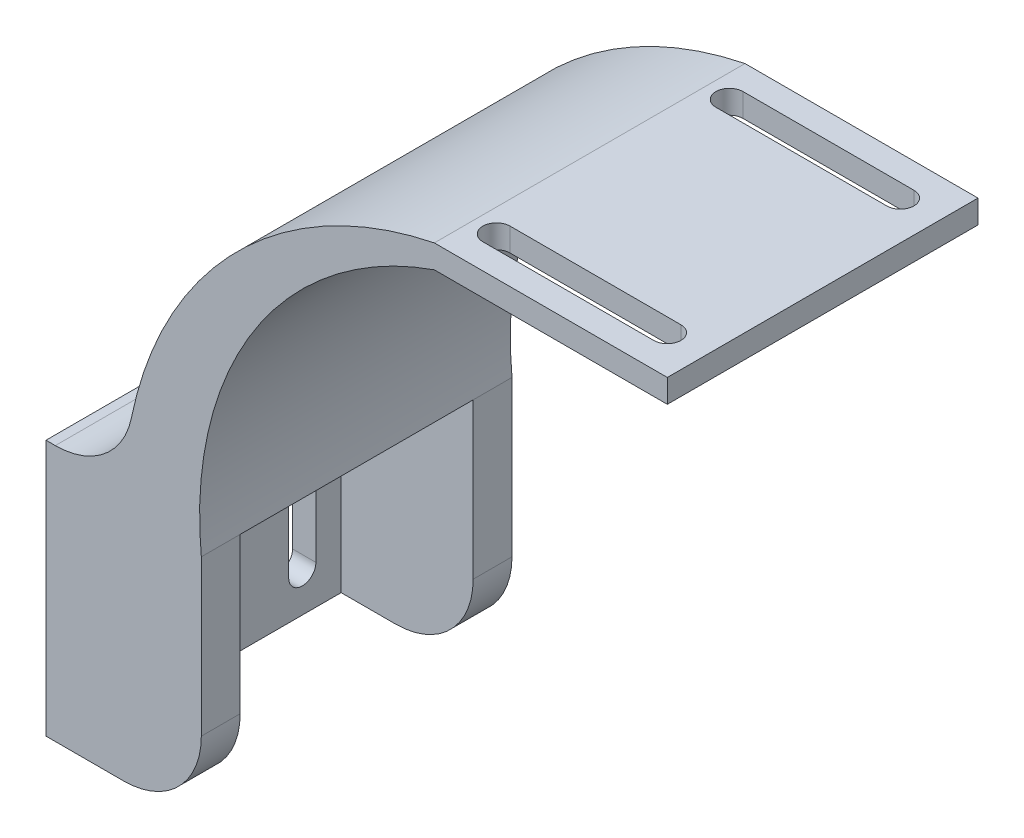
ISO-10303-21;
HEADER;
FILE_DESCRIPTION(('STEP AP214'),'2;1');
FILE_NAME('part.step','',(''),(''),'','','');
FILE_SCHEMA(('AUTOMOTIVE_DESIGN { 1 0 10303 214 1 1 1 1 }'));
ENDSEC;
DATA;
#1=APPLICATION_CONTEXT('core data for automotive mechanical design processes');
#2=APPLICATION_PROTOCOL_DEFINITION('international standard','automotive_design',2000,#1);
#3=PRODUCT_CONTEXT('',#1,'mechanical');
#4=PRODUCT('Part','Part','',(#3));
#5=PRODUCT_RELATED_PRODUCT_CATEGORY('part','',(#4));
#6=PRODUCT_DEFINITION_FORMATION('','',#4);
#7=PRODUCT_DEFINITION_CONTEXT('part definition',#1,'design');
#8=PRODUCT_DEFINITION('design','',#6,#7);
#9=PRODUCT_DEFINITION_SHAPE('','',#8);
#10=(LENGTH_UNIT() NAMED_UNIT(*) SI_UNIT(.MILLI.,.METRE.));
#11=(NAMED_UNIT(*) PLANE_ANGLE_UNIT() SI_UNIT($,.RADIAN.));
#12=(NAMED_UNIT(*) SI_UNIT($,.STERADIAN.) SOLID_ANGLE_UNIT());
#13=UNCERTAINTY_MEASURE_WITH_UNIT(LENGTH_MEASURE(1.E-05),#10,'distance_accuracy_value','');
#14=(GEOMETRIC_REPRESENTATION_CONTEXT(3) GLOBAL_UNCERTAINTY_ASSIGNED_CONTEXT((#13)) GLOBAL_UNIT_ASSIGNED_CONTEXT((#10,
#11,#12)) REPRESENTATION_CONTEXT('',''));
#15=CARTESIAN_POINT('',(0.,0.,0.));
#16=DIRECTION('',(0.,0.,1.));
#17=DIRECTION('',(1.,0.,0.));
#18=AXIS2_PLACEMENT_3D('',#15,#16,#17);
#19=CARTESIAN_POINT('',(3.,10.,-10.));
#20=DIRECTION('',(-1.,0.,0.));
#21=DIRECTION('',(0.,0.,1.));
#22=AXIS2_PLACEMENT_3D('',#19,#20,#21);
#23=CYLINDRICAL_SURFACE('',#22,1.75);
#24=CARTESIAN_POINT('',(0.,10.,-10.));
#25=DIRECTION('',(1.,0.,0.));
#26=DIRECTION('',(0.,0.,-1.));
#27=AXIS2_PLACEMENT_3D('',#24,#25,#26);
#28=CIRCLE('',#27,1.75);
#29=CARTESIAN_POINT('',(0.,10.,-11.75));
#30=VERTEX_POINT('',#29);
#31=CARTESIAN_POINT('',(0.,10.,-8.24999999999999));
#32=VERTEX_POINT('',#31);
#33=EDGE_CURVE('E462',#30,#32,#28,.T.);
#34=ORIENTED_EDGE('',*,*,#33,.F.);
#35=DIRECTION('',(-1.,0.,0.));
#36=VECTOR('',#35,1.);
#37=CARTESIAN_POINT('',(3.,10.,-11.75));
#38=LINE('',#37,#36);
#39=CARTESIAN_POINT('',(3.,10.,-11.75));
#40=VERTEX_POINT('',#39);
#41=EDGE_CURVE('E482',#40,#30,#38,.T.);
#42=ORIENTED_EDGE('',*,*,#41,.F.);
#43=CARTESIAN_POINT('',(3.,10.,-10.));
#44=DIRECTION('',(1.,0.,0.));
#45=DIRECTION('',(0.,0.,-1.));
#46=AXIS2_PLACEMENT_3D('',#43,#44,#45);
#47=CIRCLE('',#46,1.75);
#48=CARTESIAN_POINT('',(3.,10.,-8.24999999999999));
#49=VERTEX_POINT('',#48);
#50=EDGE_CURVE('E428',#40,#49,#47,.T.);
#51=ORIENTED_EDGE('',*,*,#50,.T.);
#52=DIRECTION('',(-1.,0.,0.));
#53=VECTOR('',#52,1.);
#54=CARTESIAN_POINT('',(3.,10.,-8.24999999999999));
#55=LINE('',#54,#53);
#56=EDGE_CURVE('E475',#49,#32,#55,.T.);
#57=ORIENTED_EDGE('',*,*,#56,.T.);
#58=EDGE_LOOP('',(#34,#42,#51,#57));
#59=FACE_BOUND('',#58,.T.);
#60=ADVANCED_FACE('F71',(#59),#23,.F.);
#61=CARTESIAN_POINT('',(3.,0.,-11.75));
#62=DIRECTION('',(0.,0.,-1.));
#63=DIRECTION('',(0.,1.,0.));
#64=AXIS2_PLACEMENT_3D('',#61,#62,#63);
#65=PLANE('',#64);
#66=DIRECTION('',(0.,-1.,0.));
#67=VECTOR('',#66,1.);
#68=CARTESIAN_POINT('',(0.,0.,-11.75));
#69=LINE('',#68,#67);
#70=CARTESIAN_POINT('',(0.,-10.,-11.75));
#71=VERTEX_POINT('',#70);
#72=EDGE_CURVE('E465',#30,#71,#69,.T.);
#73=ORIENTED_EDGE('',*,*,#72,.T.);
#74=DIRECTION('',(-1.,0.,0.));
#75=VECTOR('',#74,1.);
#76=CARTESIAN_POINT('',(3.,-10.,-11.75));
#77=LINE('',#76,#75);
#78=CARTESIAN_POINT('',(3.,-10.,-11.75));
#79=VERTEX_POINT('',#78);
#80=EDGE_CURVE('E480',#79,#71,#77,.T.);
#81=ORIENTED_EDGE('',*,*,#80,.F.);
#82=DIRECTION('',(0.,-1.,0.));
#83=VECTOR('',#82,1.);
#84=CARTESIAN_POINT('',(3.,0.,-11.75));
#85=LINE('',#84,#83);
#86=EDGE_CURVE('E431',#40,#79,#85,.T.);
#87=ORIENTED_EDGE('',*,*,#86,.F.);
#88=ORIENTED_EDGE('',*,*,#41,.T.);
#89=EDGE_LOOP('',(#73,#81,#87,#88));
#90=FACE_BOUND('',#89,.T.);
#91=ADVANCED_FACE('F551',(#90),#65,.F.);
#92=CARTESIAN_POINT('',(3.,-10.,-10.));
#93=DIRECTION('',(-1.,0.,0.));
#94=DIRECTION('',(0.,0.,1.));
#95=AXIS2_PLACEMENT_3D('',#92,#93,#94);
#96=CYLINDRICAL_SURFACE('',#95,1.75);
#97=CARTESIAN_POINT('',(0.,-10.,-10.));
#98=DIRECTION('',(1.,0.,0.));
#99=DIRECTION('',(0.,0.,-1.));
#100=AXIS2_PLACEMENT_3D('',#97,#98,#99);
#101=CIRCLE('',#100,1.75);
#102=CARTESIAN_POINT('',(0.,-10.,-8.25));
#103=VERTEX_POINT('',#102);
#104=EDGE_CURVE('E468',#103,#71,#101,.T.);
#105=ORIENTED_EDGE('',*,*,#104,.F.);
#106=DIRECTION('',(-1.,0.,0.));
#107=VECTOR('',#106,1.);
#108=CARTESIAN_POINT('',(3.,-10.,-8.25));
#109=LINE('',#108,#107);
#110=CARTESIAN_POINT('',(3.,-10.,-8.25));
#111=VERTEX_POINT('',#110);
#112=EDGE_CURVE('E477',#111,#103,#109,.T.);
#113=ORIENTED_EDGE('',*,*,#112,.F.);
#114=CARTESIAN_POINT('',(3.,-10.,-10.));
#115=DIRECTION('',(1.,0.,0.));
#116=DIRECTION('',(0.,0.,-1.));
#117=AXIS2_PLACEMENT_3D('',#114,#115,#116);
#118=CIRCLE('',#117,1.75);
#119=EDGE_CURVE('E433',#111,#79,#118,.T.);
#120=ORIENTED_EDGE('',*,*,#119,.T.);
#121=ORIENTED_EDGE('',*,*,#80,.T.);
#122=EDGE_LOOP('',(#105,#113,#120,#121));
#123=FACE_BOUND('',#122,.T.);
#124=ADVANCED_FACE('F557',(#123),#96,.F.);
#125=CARTESIAN_POINT('',(3.,10.,10.));
#126=DIRECTION('',(-1.,0.,0.));
#127=DIRECTION('',(0.,0.,1.));
#128=AXIS2_PLACEMENT_3D('',#125,#126,#127);
#129=CYLINDRICAL_SURFACE('',#128,1.75);
#130=CARTESIAN_POINT('',(0.,10.,10.));
#131=DIRECTION('',(1.,0.,0.));
#132=DIRECTION('',(0.,0.,-1.));
#133=AXIS2_PLACEMENT_3D('',#130,#131,#132);
#134=CIRCLE('',#133,1.75);
#135=CARTESIAN_POINT('',(0.,10.,8.25));
#136=VERTEX_POINT('',#135);
#137=CARTESIAN_POINT('',(0.,10.,11.75));
#138=VERTEX_POINT('',#137);
#139=EDGE_CURVE('E410',#136,#138,#134,.T.);
#140=ORIENTED_EDGE('',*,*,#139,.F.);
#141=DIRECTION('',(-1.,0.,0.));
#142=VECTOR('',#141,1.);
#143=CARTESIAN_POINT('',(3.,10.,8.25));
#144=LINE('',#143,#142);
#145=CARTESIAN_POINT('',(3.,10.,8.25));
#146=VERTEX_POINT('',#145);
#147=EDGE_CURVE('E478',#146,#136,#144,.T.);
#148=ORIENTED_EDGE('',*,*,#147,.F.);
#149=CARTESIAN_POINT('',(3.,10.,10.));
#150=DIRECTION('',(1.,0.,0.));
#151=DIRECTION('',(0.,0.,-1.));
#152=AXIS2_PLACEMENT_3D('',#149,#150,#151);
#153=CIRCLE('',#152,1.75);
#154=CARTESIAN_POINT('',(3.,10.,11.75));
#155=VERTEX_POINT('',#154);
#156=EDGE_CURVE('E416',#146,#155,#153,.T.);
#157=ORIENTED_EDGE('',*,*,#156,.T.);
#158=DIRECTION('',(-1.,0.,0.));
#159=VECTOR('',#158,1.);
#160=CARTESIAN_POINT('',(3.,10.,11.75));
#161=LINE('',#160,#159);
#162=EDGE_CURVE('E450',#155,#138,#161,.T.);
#163=ORIENTED_EDGE('',*,*,#162,.T.);
#164=EDGE_LOOP('',(#140,#148,#157,#163));
#165=FACE_BOUND('',#164,.T.);
#166=ADVANCED_FACE('F576',(#165),#129,.F.);
#167=CARTESIAN_POINT('',(3.,0.,8.25));
#168=DIRECTION('',(0.,0.,-1.));
#169=DIRECTION('',(0.,1.,0.));
#170=AXIS2_PLACEMENT_3D('',#167,#168,#169);
#171=PLANE('',#170);
#172=DIRECTION('',(0.,-1.,0.));
#173=VECTOR('',#172,1.);
#174=CARTESIAN_POINT('',(0.,0.,8.25));
#175=LINE('',#174,#173);
#176=CARTESIAN_POINT('',(0.,-10.,8.25));
#177=VERTEX_POINT('',#176);
#178=EDGE_CURVE('E453',#136,#177,#175,.T.);
#179=ORIENTED_EDGE('',*,*,#178,.T.);
#180=DIRECTION('',(-1.,0.,0.));
#181=VECTOR('',#180,1.);
#182=CARTESIAN_POINT('',(3.,-10.,8.25));
#183=LINE('',#182,#181);
#184=CARTESIAN_POINT('',(3.,-10.,8.25));
#185=VERTEX_POINT('',#184);
#186=EDGE_CURVE('E488',#185,#177,#183,.T.);
#187=ORIENTED_EDGE('',*,*,#186,.F.);
#188=DIRECTION('',(0.,-1.,0.));
#189=VECTOR('',#188,1.);
#190=CARTESIAN_POINT('',(3.,0.,8.25));
#191=LINE('',#190,#189);
#192=EDGE_CURVE('E419',#146,#185,#191,.T.);
#193=ORIENTED_EDGE('',*,*,#192,.F.);
#194=ORIENTED_EDGE('',*,*,#147,.T.);
#195=EDGE_LOOP('',(#179,#187,#193,#194));
#196=FACE_BOUND('',#195,.T.);
#197=ADVANCED_FACE('F572',(#196),#171,.F.);
#198=CARTESIAN_POINT('',(3.,-10.,10.));
#199=DIRECTION('',(-1.,0.,0.));
#200=DIRECTION('',(0.,0.,1.));
#201=AXIS2_PLACEMENT_3D('',#198,#199,#200);
#202=CYLINDRICAL_SURFACE('',#201,1.75);
#203=CARTESIAN_POINT('',(0.,-10.,10.));
#204=DIRECTION('',(1.,0.,0.));
#205=DIRECTION('',(0.,0.,-1.));
#206=AXIS2_PLACEMENT_3D('',#203,#204,#205);
#207=CIRCLE('',#206,1.75);
#208=CARTESIAN_POINT('',(0.,-10.,11.75));
#209=VERTEX_POINT('',#208);
#210=EDGE_CURVE('E456',#209,#177,#207,.T.);
#211=ORIENTED_EDGE('',*,*,#210,.F.);
#212=DIRECTION('',(-1.,0.,0.));
#213=VECTOR('',#212,1.);
#214=CARTESIAN_POINT('',(3.,-10.,11.75));
#215=LINE('',#214,#213);
#216=CARTESIAN_POINT('',(3.,-10.,11.75));
#217=VERTEX_POINT('',#216);
#218=EDGE_CURVE('E486',#217,#209,#215,.T.);
#219=ORIENTED_EDGE('',*,*,#218,.F.);
#220=CARTESIAN_POINT('',(3.,-10.,10.));
#221=DIRECTION('',(1.,0.,0.));
#222=DIRECTION('',(0.,0.,-1.));
#223=AXIS2_PLACEMENT_3D('',#220,#221,#222);
#224=CIRCLE('',#223,1.75);
#225=EDGE_CURVE('E422',#217,#185,#224,.T.);
#226=ORIENTED_EDGE('',*,*,#225,.T.);
#227=ORIENTED_EDGE('',*,*,#186,.T.);
#228=EDGE_LOOP('',(#211,#219,#226,#227));
#229=FACE_BOUND('',#228,.T.);
#230=ADVANCED_FACE('F569',(#229),#202,.F.);
#231=CARTESIAN_POINT('',(3.,0.,-8.25));
#232=DIRECTION('',(0.,0.,-1.));
#233=DIRECTION('',(0.,1.,0.));
#234=AXIS2_PLACEMENT_3D('',#231,#232,#233);
#235=PLANE('',#234);
#236=DIRECTION('',(0.,-1.,0.));
#237=VECTOR('',#236,1.);
#238=CARTESIAN_POINT('',(0.,0.,-8.25));
#239=LINE('',#238,#237);
#240=EDGE_CURVE('E471',#32,#103,#239,.T.);
#241=ORIENTED_EDGE('',*,*,#240,.F.);
#242=ORIENTED_EDGE('',*,*,#56,.F.);
#243=DIRECTION('',(0.,-1.,0.));
#244=VECTOR('',#243,1.);
#245=CARTESIAN_POINT('',(3.,0.,-8.25));
#246=LINE('',#245,#244);
#247=EDGE_CURVE('E436',#49,#111,#246,.T.);
#248=ORIENTED_EDGE('',*,*,#247,.T.);
#249=ORIENTED_EDGE('',*,*,#112,.T.);
#250=EDGE_LOOP('',(#241,#242,#248,#249));
#251=FACE_BOUND('',#250,.T.);
#252=ADVANCED_FACE('F567',(#251),#235,.T.);
#253=CARTESIAN_POINT('',(3.,0.,11.75));
#254=DIRECTION('',(0.,0.,-1.));
#255=DIRECTION('',(0.,1.,0.));
#256=AXIS2_PLACEMENT_3D('',#253,#254,#255);
#257=PLANE('',#256);
#258=DIRECTION('',(0.,-1.,0.));
#259=VECTOR('',#258,1.);
#260=CARTESIAN_POINT('',(0.,0.,11.75));
#261=LINE('',#260,#259);
#262=EDGE_CURVE('E459',#138,#209,#261,.T.);
#263=ORIENTED_EDGE('',*,*,#262,.F.);
#264=ORIENTED_EDGE('',*,*,#162,.F.);
#265=DIRECTION('',(0.,-1.,0.));
#266=VECTOR('',#265,1.);
#267=CARTESIAN_POINT('',(3.,0.,11.75));
#268=LINE('',#267,#266);
#269=EDGE_CURVE('E425',#155,#217,#268,.T.);
#270=ORIENTED_EDGE('',*,*,#269,.T.);
#271=ORIENTED_EDGE('',*,*,#218,.T.);
#272=EDGE_LOOP('',(#263,#264,#270,#271));
#273=FACE_BOUND('',#272,.T.);
#274=ADVANCED_FACE('F563',(#273),#257,.T.);
#275=CARTESIAN_POINT('',(3.,-15.,0.));
#276=DIRECTION('',(0.,1.,0.));
#277=DIRECTION('',(0.,0.,1.));
#278=AXIS2_PLACEMENT_3D('',#275,#276,#277);
#279=PLANE('',#278);
#280=DIRECTION('',(1.,0.,0.));
#281=VECTOR('',#280,1.);
#282=CARTESIAN_POINT('',(0.,-15.,-20.));
#283=LINE('',#282,#281);
#284=CARTESIAN_POINT('',(0.,-15.,-20.));
#285=VERTEX_POINT('',#284);
#286=CARTESIAN_POINT('',(10.,-15.,-20.));
#287=VERTEX_POINT('',#286);
#288=EDGE_CURVE('E400',#285,#287,#283,.T.);
#289=ORIENTED_EDGE('',*,*,#288,.T.);
#290=DIRECTION('',(0.,0.,1.));
#291=VECTOR('',#290,1.);
#292=CARTESIAN_POINT('',(10.,-15.,-15.));
#293=LINE('',#292,#291);
#294=CARTESIAN_POINT('',(10.,-15.,-15.));
#295=VERTEX_POINT('',#294);
#296=EDGE_CURVE('E502',#287,#295,#293,.T.);
#297=ORIENTED_EDGE('',*,*,#296,.T.);
#298=DIRECTION('',(-1.,0.,0.));
#299=VECTOR('',#298,1.);
#300=CARTESIAN_POINT('',(0.,-15.,-15.));
#301=LINE('',#300,#299);
#302=CARTESIAN_POINT('',(3.,-15.,-15.));
#303=VERTEX_POINT('',#302);
#304=EDGE_CURVE('E390',#295,#303,#301,.T.);
#305=ORIENTED_EDGE('',*,*,#304,.T.);
#306=DIRECTION('',(0.,0.,-1.));
#307=VECTOR('',#306,1.);
#308=CARTESIAN_POINT('',(3.,-15.,0.));
#309=LINE('',#308,#307);
#310=CARTESIAN_POINT('',(3.,-15.,15.));
#311=VERTEX_POINT('',#310);
#312=EDGE_CURVE('E447',#311,#303,#309,.T.);
#313=ORIENTED_EDGE('',*,*,#312,.F.);
#314=DIRECTION('',(-1.,0.,0.));
#315=VECTOR('',#314,1.);
#316=CARTESIAN_POINT('',(0.,-15.,15.));
#317=LINE('',#316,#315);
#318=CARTESIAN_POINT('',(10.,-15.,15.));
#319=VERTEX_POINT('',#318);
#320=EDGE_CURVE('E381',#319,#311,#317,.T.);
#321=ORIENTED_EDGE('',*,*,#320,.F.);
#322=DIRECTION('',(0.,0.,1.));
#323=VECTOR('',#322,1.);
#324=CARTESIAN_POINT('',(10.,-15.,20.));
#325=LINE('',#324,#323);
#326=CARTESIAN_POINT('',(10.,-15.,20.));
#327=VERTEX_POINT('',#326);
#328=EDGE_CURVE('E499',#319,#327,#325,.T.);
#329=ORIENTED_EDGE('',*,*,#328,.T.);
#330=DIRECTION('',(-1.,0.,0.));
#331=VECTOR('',#330,1.);
#332=CARTESIAN_POINT('',(0.,-15.,20.));
#333=LINE('',#332,#331);
#334=CARTESIAN_POINT('',(0.,-15.,20.));
#335=VERTEX_POINT('',#334);
#336=EDGE_CURVE('E352',#327,#335,#333,.T.);
#337=ORIENTED_EDGE('',*,*,#336,.T.);
#338=DIRECTION('',(0.,0.,-1.));
#339=VECTOR('',#338,1.);
#340=CARTESIAN_POINT('',(0.,-15.,0.));
#341=LINE('',#340,#339);
#342=EDGE_CURVE('E420',#335,#285,#341,.T.);
#343=ORIENTED_EDGE('',*,*,#342,.T.);
#344=EDGE_LOOP('',(#289,#297,#305,#313,#321,#329,#337,#343));
#345=FACE_BOUND('',#344,.T.);
#346=ADVANCED_FACE('F566',(#345),#279,.F.);
#347=CARTESIAN_POINT('',(3.,0.,0.));
#348=DIRECTION('',(1.,0.,0.));
#349=DIRECTION('',(0.,0.,-1.));
#350=AXIS2_PLACEMENT_3D('',#347,#348,#349);
#351=PLANE('',#350);
#352=ORIENTED_EDGE('',*,*,#156,.F.);
#353=ORIENTED_EDGE('',*,*,#192,.T.);
#354=ORIENTED_EDGE('',*,*,#225,.F.);
#355=ORIENTED_EDGE('',*,*,#269,.F.);
#356=EDGE_LOOP('',(#352,#353,#354,#355));
#357=FACE_BOUND('',#356,.T.);
#358=ORIENTED_EDGE('',*,*,#50,.F.);
#359=ORIENTED_EDGE('',*,*,#86,.T.);
#360=ORIENTED_EDGE('',*,*,#119,.F.);
#361=ORIENTED_EDGE('',*,*,#247,.F.);
#362=EDGE_LOOP('',(#358,#359,#360,#361));
#363=FACE_BOUND('',#362,.T.);
#364=DIRECTION('',(0.,-1.,0.));
#365=VECTOR('',#364,1.);
#366=CARTESIAN_POINT('',(3.,0.,-15.));
#367=LINE('',#366,#365);
#368=CARTESIAN_POINT('',(3.,15.,-15.));
#369=VERTEX_POINT('',#368);
#370=EDGE_CURVE('E439',#369,#303,#367,.T.);
#371=ORIENTED_EDGE('',*,*,#370,.F.);
#372=DIRECTION('',(0.,0.,-1.));
#373=VECTOR('',#372,1.);
#374=CARTESIAN_POINT('',(3.,15.,0.));
#375=LINE('',#374,#373);
#376=CARTESIAN_POINT('',(3.,15.,15.));
#377=VERTEX_POINT('',#376);
#378=EDGE_CURVE('E442',#377,#369,#375,.T.);
#379=ORIENTED_EDGE('',*,*,#378,.F.);
#380=DIRECTION('',(0.,-1.,0.));
#381=VECTOR('',#380,1.);
#382=CARTESIAN_POINT('',(3.,0.,15.));
#383=LINE('',#382,#381);
#384=EDGE_CURVE('E444',#377,#311,#383,.T.);
#385=ORIENTED_EDGE('',*,*,#384,.T.);
#386=ORIENTED_EDGE('',*,*,#312,.T.);
#387=EDGE_LOOP('',(#371,#379,#385,#386));
#388=FACE_BOUND('',#387,.T.);
#389=ADVANCED_FACE('F644',(#357,#363,#388),#351,.T.);
#390=CARTESIAN_POINT('',(0.,0.,0.));
#391=DIRECTION('',(1.,0.,0.));
#392=DIRECTION('',(0.,0.,-1.));
#393=AXIS2_PLACEMENT_3D('',#390,#391,#392);
#394=PLANE('',#393);
#395=ORIENTED_EDGE('',*,*,#139,.T.);
#396=ORIENTED_EDGE('',*,*,#262,.T.);
#397=ORIENTED_EDGE('',*,*,#210,.T.);
#398=ORIENTED_EDGE('',*,*,#178,.F.);
#399=EDGE_LOOP('',(#395,#396,#397,#398));
#400=FACE_BOUND('',#399,.T.);
#401=ORIENTED_EDGE('',*,*,#33,.T.);
#402=ORIENTED_EDGE('',*,*,#240,.T.);
#403=ORIENTED_EDGE('',*,*,#104,.T.);
#404=ORIENTED_EDGE('',*,*,#72,.F.);
#405=EDGE_LOOP('',(#401,#402,#403,#404));
#406=FACE_BOUND('',#405,.T.);
#407=DIRECTION('',(0.,-1.,0.));
#408=VECTOR('',#407,1.);
#409=CARTESIAN_POINT('',(0.,15.,20.));
#410=LINE('',#409,#408);
#411=CARTESIAN_POINT('',(0.,18.,20.));
#412=VERTEX_POINT('',#411);
#413=EDGE_CURVE('E384',#412,#335,#410,.T.);
#414=ORIENTED_EDGE('',*,*,#413,.F.);
#415=DIRECTION('',(0.,0.,1.));
#416=VECTOR('',#415,1.);
#417=CARTESIAN_POINT('',(0.,18.,-20.));
#418=LINE('',#417,#416);
#419=CARTESIAN_POINT('',(0.,18.,-20.));
#420=VERTEX_POINT('',#419);
#421=EDGE_CURVE('E356',#420,#412,#418,.T.);
#422=ORIENTED_EDGE('',*,*,#421,.F.);
#423=DIRECTION('',(0.,-1.,0.));
#424=VECTOR('',#423,1.);
#425=CARTESIAN_POINT('',(0.,15.,-20.));
#426=LINE('',#425,#424);
#427=EDGE_CURVE('E411',#420,#285,#426,.T.);
#428=ORIENTED_EDGE('',*,*,#427,.T.);
#429=ORIENTED_EDGE('',*,*,#342,.F.);
#430=EDGE_LOOP('',(#414,#422,#428,#429));
#431=FACE_BOUND('',#430,.T.);
#432=ADVANCED_FACE('F605',(#400,#406,#431),#394,.F.);
#433=CARTESIAN_POINT('',(20.,15.,0.));
#434=DIRECTION('',(1.,0.,0.));
#435=DIRECTION('',(0.,0.,-1.));
#436=AXIS2_PLACEMENT_3D('',#433,#434,#435);
#437=PLANE('',#436);
#438=DIRECTION('',(0.,-1.,0.));
#439=VECTOR('',#438,1.);
#440=CARTESIAN_POINT('',(20.,15.,-15.));
#441=LINE('',#440,#439);
#442=CARTESIAN_POINT('',(20.,15.,-15.));
#443=VERTEX_POINT('',#442);
#444=CARTESIAN_POINT('',(20.,-5.,-15.));
#445=VERTEX_POINT('',#444);
#446=EDGE_CURVE('E403',#443,#445,#441,.T.);
#447=ORIENTED_EDGE('',*,*,#446,.T.);
#448=DIRECTION('',(0.,0.,1.));
#449=VECTOR('',#448,1.);
#450=CARTESIAN_POINT('',(20.,-5.,-20.));
#451=LINE('',#450,#449);
#452=CARTESIAN_POINT('',(20.,-5.,-20.));
#453=VERTEX_POINT('',#452);
#454=EDGE_CURVE('E507',#445,#453,#451,.F.);
#455=ORIENTED_EDGE('',*,*,#454,.T.);
#456=DIRECTION('',(0.,-1.,0.));
#457=VECTOR('',#456,1.);
#458=CARTESIAN_POINT('',(20.,15.,-20.));
#459=LINE('',#458,#457);
#460=CARTESIAN_POINT('',(20.,15.,-20.));
#461=VERTEX_POINT('',#460);
#462=EDGE_CURVE('E407',#461,#453,#459,.T.);
#463=ORIENTED_EDGE('',*,*,#462,.F.);
#464=DIRECTION('',(0.,0.,1.));
#465=VECTOR('',#464,1.);
#466=CARTESIAN_POINT('',(20.,15.,0.));
#467=LINE('',#466,#465);
#468=EDGE_CURVE('E396',#461,#443,#467,.T.);
#469=ORIENTED_EDGE('',*,*,#468,.T.);
#470=EDGE_LOOP('',(#447,#455,#463,#469));
#471=FACE_BOUND('',#470,.T.);
#472=ADVANCED_FACE('F637',(#471),#437,.T.);
#473=CARTESIAN_POINT('',(0.,15.,-20.));
#474=DIRECTION('',(0.,0.,-1.));
#475=DIRECTION('',(-1.,0.,0.));
#476=AXIS2_PLACEMENT_3D('',#473,#474,#475);
#477=PLANE('',#476);
#478=ORIENTED_EDGE('',*,*,#462,.T.);
#479=CARTESIAN_POINT('',(10.,-5.,-20.));
#480=DIRECTION('',(0.,0.,-1.));
#481=DIRECTION('',(-1.,0.,0.));
#482=AXIS2_PLACEMENT_3D('',#479,#480,#481);
#483=CIRCLE('',#482,10.);
#484=EDGE_CURVE('E509',#453,#287,#483,.T.);
#485=ORIENTED_EDGE('',*,*,#484,.T.);
#486=ORIENTED_EDGE('',*,*,#288,.F.);
#487=ORIENTED_EDGE('',*,*,#427,.F.);
#488=DIRECTION('',(1.,0.,0.));
#489=VECTOR('',#488,1.);
#490=CARTESIAN_POINT('',(0.,18.,-20.));
#491=LINE('',#490,#489);
#492=CARTESIAN_POINT('',(1.20042260838939,18.,-20.));
#493=VERTEX_POINT('',#492);
#494=EDGE_CURVE('E335',#420,#493,#491,.T.);
#495=ORIENTED_EDGE('',*,*,#494,.T.);
#496=CARTESIAN_POINT('',(1.20042260838939,28.,-20.));
#497=DIRECTION('',(0.,0.,-1.));
#498=DIRECTION('',(-1.,0.,0.));
#499=AXIS2_PLACEMENT_3D('',#496,#497,#498);
#500=CIRCLE('',#499,10.);
#501=CARTESIAN_POINT('',(10.9986581197383,26.0013552431356,-20.));
#502=VERTEX_POINT('',#501);
#503=EDGE_CURVE('E497',#493,#502,#500,.F.);
#504=ORIENTED_EDGE('',*,*,#503,.T.);
#505=CARTESIAN_POINT('',(59.9898356764828,16.0081314588138,-20.));
#506=DIRECTION('',(0.,0.,1.));
#507=DIRECTION('',(1.,0.,0.));
#508=AXIS2_PLACEMENT_3D('',#505,#506,#507);
#509=CIRCLE('',#508,50.);
#510=CARTESIAN_POINT('',(50.,65.,-20.));
#511=VERTEX_POINT('',#510);
#512=EDGE_CURVE('E332',#511,#502,#509,.T.);
#513=ORIENTED_EDGE('',*,*,#512,.F.);
#514=DIRECTION('',(1.,0.,0.));
#515=VECTOR('',#514,1.);
#516=CARTESIAN_POINT('',(50.,65.,-20.));
#517=LINE('',#516,#515);
#518=CARTESIAN_POINT('',(80.,65.,-20.));
#519=VERTEX_POINT('',#518);
#520=EDGE_CURVE('E360',#511,#519,#517,.T.);
#521=ORIENTED_EDGE('',*,*,#520,.T.);
#522=DIRECTION('',(0.,-1.,0.));
#523=VECTOR('',#522,1.);
#524=CARTESIAN_POINT('',(80.,65.,-20.));
#525=LINE('',#524,#523);
#526=CARTESIAN_POINT('',(80.,62.,-20.));
#527=VERTEX_POINT('',#526);
#528=EDGE_CURVE('E362',#519,#527,#525,.T.);
#529=ORIENTED_EDGE('',*,*,#528,.T.);
#530=DIRECTION('',(-1.,0.,0.));
#531=VECTOR('',#530,1.);
#532=CARTESIAN_POINT('',(80.,62.,-20.));
#533=LINE('',#532,#531);
#534=CARTESIAN_POINT('',(50.,62.,-20.));
#535=VERTEX_POINT('',#534);
#536=EDGE_CURVE('E365',#527,#535,#533,.T.);
#537=ORIENTED_EDGE('',*,*,#536,.T.);
#538=CARTESIAN_POINT('',(64.7749668191806,19.4947020303103,-20.));
#539=DIRECTION('',(0.,0.,1.));
#540=DIRECTION('',(1.,0.,0.));
#541=AXIS2_PLACEMENT_3D('',#538,#539,#540);
#542=CIRCLE('',#541,45.);
#543=EDGE_CURVE('E339',#535,#461,#542,.T.);
#544=ORIENTED_EDGE('',*,*,#543,.T.);
#545=EDGE_LOOP('',(#478,#485,#486,#487,#495,#504,#513,#521,#529,#537,#544));
#546=FACE_BOUND('',#545,.T.);
#547=ADVANCED_FACE('F597',(#546),#477,.T.);
#548=CARTESIAN_POINT('',(0.,15.,-15.));
#549=DIRECTION('',(0.,0.,1.));
#550=DIRECTION('',(1.,0.,0.));
#551=AXIS2_PLACEMENT_3D('',#548,#549,#550);
#552=PLANE('',#551);
#553=ORIENTED_EDGE('',*,*,#304,.F.);
#554=CARTESIAN_POINT('',(10.,-5.,-15.));
#555=DIRECTION('',(0.,0.,1.));
#556=DIRECTION('',(1.,0.,0.));
#557=AXIS2_PLACEMENT_3D('',#554,#555,#556);
#558=CIRCLE('',#557,10.);
#559=EDGE_CURVE('E505',#295,#445,#558,.T.);
#560=ORIENTED_EDGE('',*,*,#559,.T.);
#561=ORIENTED_EDGE('',*,*,#446,.F.);
#562=DIRECTION('',(-1.,0.,0.));
#563=VECTOR('',#562,1.);
#564=CARTESIAN_POINT('',(0.,15.,-15.));
#565=LINE('',#564,#563);
#566=EDGE_CURVE('E399',#443,#369,#565,.T.);
#567=ORIENTED_EDGE('',*,*,#566,.T.);
#568=ORIENTED_EDGE('',*,*,#370,.T.);
#569=EDGE_LOOP('',(#553,#560,#561,#567,#568));
#570=FACE_BOUND('',#569,.T.);
#571=ADVANCED_FACE('F639',(#570),#552,.T.);
#572=CARTESIAN_POINT('',(0.,15.,20.));
#573=DIRECTION('',(0.,0.,1.));
#574=DIRECTION('',(1.,0.,0.));
#575=AXIS2_PLACEMENT_3D('',#572,#573,#574);
#576=PLANE('',#575);
#577=ORIENTED_EDGE('',*,*,#336,.F.);
#578=CARTESIAN_POINT('',(10.,-5.,20.));
#579=DIRECTION('',(0.,0.,1.));
#580=DIRECTION('',(1.,0.,0.));
#581=AXIS2_PLACEMENT_3D('',#578,#579,#580);
#582=CIRCLE('',#581,10.);
#583=CARTESIAN_POINT('',(20.,-5.,20.));
#584=VERTEX_POINT('',#583);
#585=EDGE_CURVE('E511',#327,#584,#582,.T.);
#586=ORIENTED_EDGE('',*,*,#585,.T.);
#587=DIRECTION('',(0.,-1.,0.));
#588=VECTOR('',#587,1.);
#589=CARTESIAN_POINT('',(20.,15.,20.));
#590=LINE('',#589,#588);
#591=CARTESIAN_POINT('',(20.,15.,20.));
#592=VERTEX_POINT('',#591);
#593=EDGE_CURVE('E387',#592,#584,#590,.T.);
#594=ORIENTED_EDGE('',*,*,#593,.F.);
#595=CARTESIAN_POINT('',(64.7749668191806,19.4947020303103,20.));
#596=DIRECTION('',(0.,0.,1.));
#597=DIRECTION('',(1.,0.,0.));
#598=AXIS2_PLACEMENT_3D('',#595,#596,#597);
#599=CIRCLE('',#598,45.);
#600=CARTESIAN_POINT('',(50.,62.,20.));
#601=VERTEX_POINT('',#600);
#602=EDGE_CURVE('E336',#601,#592,#599,.T.);
#603=ORIENTED_EDGE('',*,*,#602,.F.);
#604=DIRECTION('',(-1.,0.,0.));
#605=VECTOR('',#604,1.);
#606=CARTESIAN_POINT('',(80.,62.,20.));
#607=LINE('',#606,#605);
#608=CARTESIAN_POINT('',(80.,62.,20.));
#609=VERTEX_POINT('',#608);
#610=EDGE_CURVE('E363',#609,#601,#607,.T.);
#611=ORIENTED_EDGE('',*,*,#610,.F.);
#612=DIRECTION('',(0.,-1.,0.));
#613=VECTOR('',#612,1.);
#614=CARTESIAN_POINT('',(80.,65.,20.));
#615=LINE('',#614,#613);
#616=CARTESIAN_POINT('',(80.,65.,20.));
#617=VERTEX_POINT('',#616);
#618=EDGE_CURVE('E370',#617,#609,#615,.T.);
#619=ORIENTED_EDGE('',*,*,#618,.F.);
#620=DIRECTION('',(1.,0.,0.));
#621=VECTOR('',#620,1.);
#622=CARTESIAN_POINT('',(50.,65.,20.));
#623=LINE('',#622,#621);
#624=CARTESIAN_POINT('',(50.,65.,20.));
#625=VERTEX_POINT('',#624);
#626=EDGE_CURVE('E311',#625,#617,#623,.T.);
#627=ORIENTED_EDGE('',*,*,#626,.F.);
#628=CARTESIAN_POINT('',(59.9898356764828,16.0081314588138,20.));
#629=DIRECTION('',(0.,0.,1.));
#630=DIRECTION('',(1.,0.,0.));
#631=AXIS2_PLACEMENT_3D('',#628,#629,#630);
#632=CIRCLE('',#631,50.);
#633=CARTESIAN_POINT('',(10.9986581197383,26.0013552431356,20.));
#634=VERTEX_POINT('',#633);
#635=EDGE_CURVE('E342',#625,#634,#632,.T.);
#636=ORIENTED_EDGE('',*,*,#635,.T.);
#637=CARTESIAN_POINT('',(1.20042260838939,28.,20.));
#638=DIRECTION('',(0.,0.,1.));
#639=DIRECTION('',(1.,0.,0.));
#640=AXIS2_PLACEMENT_3D('',#637,#638,#639);
#641=CIRCLE('',#640,10.);
#642=CARTESIAN_POINT('',(1.20042260838939,18.,20.));
#643=VERTEX_POINT('',#642);
#644=EDGE_CURVE('E495',#634,#643,#641,.F.);
#645=ORIENTED_EDGE('',*,*,#644,.T.);
#646=DIRECTION('',(1.,0.,0.));
#647=VECTOR('',#646,1.);
#648=CARTESIAN_POINT('',(0.,18.,20.));
#649=LINE('',#648,#647);
#650=EDGE_CURVE('E345',#412,#643,#649,.T.);
#651=ORIENTED_EDGE('',*,*,#650,.F.);
#652=ORIENTED_EDGE('',*,*,#413,.T.);
#653=EDGE_LOOP('',(#577,#586,#594,#603,#611,#619,#627,#636,#645,#651,#652));
#654=FACE_BOUND('',#653,.T.);
#655=ADVANCED_FACE('F617',(#654),#576,.T.);
#656=CARTESIAN_POINT('',(20.,15.,0.));
#657=DIRECTION('',(1.,0.,0.));
#658=DIRECTION('',(0.,0.,-1.));
#659=AXIS2_PLACEMENT_3D('',#656,#657,#658);
#660=PLANE('',#659);
#661=ORIENTED_EDGE('',*,*,#593,.T.);
#662=DIRECTION('',(0.,0.,1.));
#663=VECTOR('',#662,1.);
#664=CARTESIAN_POINT('',(20.,-5.,15.));
#665=LINE('',#664,#663);
#666=CARTESIAN_POINT('',(20.,-5.,15.));
#667=VERTEX_POINT('',#666);
#668=EDGE_CURVE('E513',#584,#667,#665,.F.);
#669=ORIENTED_EDGE('',*,*,#668,.T.);
#670=DIRECTION('',(0.,-1.,0.));
#671=VECTOR('',#670,1.);
#672=CARTESIAN_POINT('',(20.,15.,15.));
#673=LINE('',#672,#671);
#674=CARTESIAN_POINT('',(20.,15.,15.));
#675=VERTEX_POINT('',#674);
#676=EDGE_CURVE('E391',#675,#667,#673,.T.);
#677=ORIENTED_EDGE('',*,*,#676,.F.);
#678=DIRECTION('',(0.,0.,1.));
#679=VECTOR('',#678,1.);
#680=CARTESIAN_POINT('',(20.,15.,0.));
#681=LINE('',#680,#679);
#682=EDGE_CURVE('E380',#675,#592,#681,.T.);
#683=ORIENTED_EDGE('',*,*,#682,.T.);
#684=EDGE_LOOP('',(#661,#669,#677,#683));
#685=FACE_BOUND('',#684,.T.);
#686=ADVANCED_FACE('F656',(#685),#660,.T.);
#687=CARTESIAN_POINT('',(0.,15.,15.));
#688=DIRECTION('',(0.,0.,1.));
#689=DIRECTION('',(1.,0.,0.));
#690=AXIS2_PLACEMENT_3D('',#687,#688,#689);
#691=PLANE('',#690);
#692=ORIENTED_EDGE('',*,*,#676,.T.);
#693=CARTESIAN_POINT('',(10.,-5.,15.));
#694=DIRECTION('',(0.,0.,1.));
#695=DIRECTION('',(1.,0.,0.));
#696=AXIS2_PLACEMENT_3D('',#693,#694,#695);
#697=CIRCLE('',#696,10.);
#698=EDGE_CURVE('E515',#667,#319,#697,.F.);
#699=ORIENTED_EDGE('',*,*,#698,.T.);
#700=ORIENTED_EDGE('',*,*,#320,.T.);
#701=ORIENTED_EDGE('',*,*,#384,.F.);
#702=DIRECTION('',(-1.,0.,0.));
#703=VECTOR('',#702,1.);
#704=CARTESIAN_POINT('',(0.,15.,15.));
#705=LINE('',#704,#703);
#706=EDGE_CURVE('E378',#675,#377,#705,.T.);
#707=ORIENTED_EDGE('',*,*,#706,.F.);
#708=EDGE_LOOP('',(#692,#699,#700,#701,#707));
#709=FACE_BOUND('',#708,.T.);
#710=ADVANCED_FACE('F649',(#709),#691,.F.);
#711=CARTESIAN_POINT('',(0.,15.,-20.));
#712=DIRECTION('',(0.,1.,0.));
#713=DIRECTION('',(0.,0.,1.));
#714=AXIS2_PLACEMENT_3D('',#711,#712,#713);
#715=PLANE('',#714);
#716=DIRECTION('',(0.,0.,1.));
#717=VECTOR('',#716,1.);
#718=CARTESIAN_POINT('',(20.,15.,-20.));
#719=LINE('',#718,#717);
#720=EDGE_CURVE('E353',#443,#675,#719,.T.);
#721=ORIENTED_EDGE('',*,*,#720,.T.);
#722=ORIENTED_EDGE('',*,*,#706,.T.);
#723=ORIENTED_EDGE('',*,*,#378,.T.);
#724=ORIENTED_EDGE('',*,*,#566,.F.);
#725=EDGE_LOOP('',(#721,#722,#723,#724));
#726=FACE_BOUND('',#725,.T.);
#727=ADVANCED_FACE('F659',(#726),#715,.F.);
#728=CARTESIAN_POINT('',(64.7749668191806,19.4947020303103,-20.));
#729=DIRECTION('',(0.,0.,1.));
#730=DIRECTION('',(1.,0.,0.));
#731=AXIS2_PLACEMENT_3D('',#728,#729,#730);
#732=CYLINDRICAL_SURFACE('',#731,45.);
#733=ORIENTED_EDGE('',*,*,#602,.T.);
#734=ORIENTED_EDGE('',*,*,#682,.F.);
#735=ORIENTED_EDGE('',*,*,#720,.F.);
#736=ORIENTED_EDGE('',*,*,#468,.F.);
#737=ORIENTED_EDGE('',*,*,#543,.F.);
#738=DIRECTION('',(0.,0.,1.));
#739=VECTOR('',#738,1.);
#740=CARTESIAN_POINT('',(50.,62.,-20.));
#741=LINE('',#740,#739);
#742=EDGE_CURVE('E350',#535,#601,#741,.T.);
#743=ORIENTED_EDGE('',*,*,#742,.T.);
#744=EDGE_LOOP('',(#733,#734,#735,#736,#737,#743));
#745=FACE_BOUND('',#744,.T.);
#746=ADVANCED_FACE('F633',(#745),#732,.F.);
#747=CARTESIAN_POINT('',(0.,18.,-20.));
#748=DIRECTION('',(0.,-1.,0.));
#749=DIRECTION('',(0.,0.,-1.));
#750=AXIS2_PLACEMENT_3D('',#747,#748,#749);
#751=PLANE('',#750);
#752=ORIENTED_EDGE('',*,*,#650,.T.);
#753=DIRECTION('',(0.,0.,1.));
#754=VECTOR('',#753,1.);
#755=CARTESIAN_POINT('',(1.20042260838939,18.,-20.));
#756=LINE('',#755,#754);
#757=EDGE_CURVE('E493',#643,#493,#756,.F.);
#758=ORIENTED_EDGE('',*,*,#757,.T.);
#759=ORIENTED_EDGE('',*,*,#494,.F.);
#760=ORIENTED_EDGE('',*,*,#421,.T.);
#761=EDGE_LOOP('',(#752,#758,#759,#760));
#762=FACE_BOUND('',#761,.T.);
#763=ADVANCED_FACE('F666',(#762),#751,.F.);
#764=CARTESIAN_POINT('',(59.9898356764828,16.0081314588138,-20.));
#765=DIRECTION('',(0.,0.,1.));
#766=DIRECTION('',(1.,0.,0.));
#767=AXIS2_PLACEMENT_3D('',#764,#765,#766);
#768=CYLINDRICAL_SURFACE('',#767,50.);
#769=ORIENTED_EDGE('',*,*,#512,.T.);
#770=DIRECTION('',(0.,0.,1.));
#771=VECTOR('',#770,1.);
#772=CARTESIAN_POINT('',(10.9986581197383,26.0013552431356,-20.));
#773=LINE('',#772,#771);
#774=EDGE_CURVE('E484',#502,#634,#773,.T.);
#775=ORIENTED_EDGE('',*,*,#774,.T.);
#776=ORIENTED_EDGE('',*,*,#635,.F.);
#777=DIRECTION('',(0.,0.,1.));
#778=VECTOR('',#777,1.);
#779=CARTESIAN_POINT('',(50.,65.,-20.));
#780=LINE('',#779,#778);
#781=EDGE_CURVE('E341',#511,#625,#780,.T.);
#782=ORIENTED_EDGE('',*,*,#781,.F.);
#783=EDGE_LOOP('',(#769,#775,#776,#782));
#784=FACE_BOUND('',#783,.T.);
#785=ADVANCED_FACE('F614',(#784),#768,.T.);
#786=CARTESIAN_POINT('',(50.,65.,-20.));
#787=DIRECTION('',(0.,-1.,0.));
#788=DIRECTION('',(1.,0.,0.));
#789=AXIS2_PLACEMENT_3D('',#786,#787,#788);
#790=PLANE('',#789);
#791=DIRECTION('',(-1.,0.,0.));
#792=VECTOR('',#791,1.);
#793=CARTESIAN_POINT('',(0.,65.,16.75));
#794=LINE('',#793,#792);
#795=CARTESIAN_POINT('',(75.,65.,16.75));
#796=VERTEX_POINT('',#795);
#797=CARTESIAN_POINT('',(53.,65.,16.75));
#798=VERTEX_POINT('',#797);
#799=EDGE_CURVE('E297',#796,#798,#794,.T.);
#800=ORIENTED_EDGE('',*,*,#799,.T.);
#801=CARTESIAN_POINT('',(53.,65.,15.));
#802=DIRECTION('',(0.,1.,0.));
#803=DIRECTION('',(-1.,0.,0.));
#804=AXIS2_PLACEMENT_3D('',#801,#802,#803);
#805=CIRCLE('',#804,1.75);
#806=CARTESIAN_POINT('',(53.,65.,13.25));
#807=VERTEX_POINT('',#806);
#808=EDGE_CURVE('E86',#807,#798,#805,.T.);
#809=ORIENTED_EDGE('',*,*,#808,.F.);
#810=DIRECTION('',(1.,0.,0.));
#811=VECTOR('',#810,1.);
#812=CARTESIAN_POINT('',(0.,65.,13.25));
#813=LINE('',#812,#811);
#814=CARTESIAN_POINT('',(75.,65.,13.25));
#815=VERTEX_POINT('',#814);
#816=EDGE_CURVE('E304',#807,#815,#813,.T.);
#817=ORIENTED_EDGE('',*,*,#816,.T.);
#818=CARTESIAN_POINT('',(75.,65.,15.));
#819=DIRECTION('',(0.,1.,0.));
#820=DIRECTION('',(-1.,0.,0.));
#821=AXIS2_PLACEMENT_3D('',#818,#819,#820);
#822=CIRCLE('',#821,1.75);
#823=EDGE_CURVE('E287',#796,#815,#822,.T.);
#824=ORIENTED_EDGE('',*,*,#823,.F.);
#825=EDGE_LOOP('',(#800,#809,#817,#824));
#826=FACE_BOUND('',#825,.T.);
#827=DIRECTION('',(-1.,0.,0.));
#828=VECTOR('',#827,1.);
#829=CARTESIAN_POINT('',(0.,65.,-13.25));
#830=LINE('',#829,#828);
#831=CARTESIAN_POINT('',(75.,65.,-13.25));
#832=VERTEX_POINT('',#831);
#833=CARTESIAN_POINT('',(53.,65.,-13.25));
#834=VERTEX_POINT('',#833);
#835=EDGE_CURVE('E315',#832,#834,#830,.T.);
#836=ORIENTED_EDGE('',*,*,#835,.T.);
#837=CARTESIAN_POINT('',(53.,65.,-15.));
#838=DIRECTION('',(0.,1.,0.));
#839=DIRECTION('',(-1.,0.,0.));
#840=AXIS2_PLACEMENT_3D('',#837,#838,#839);
#841=CIRCLE('',#840,1.75);
#842=CARTESIAN_POINT('',(53.,65.,-16.75));
#843=VERTEX_POINT('',#842);
#844=EDGE_CURVE('E94',#843,#834,#841,.T.);
#845=ORIENTED_EDGE('',*,*,#844,.F.);
#846=DIRECTION('',(1.,0.,0.));
#847=VECTOR('',#846,1.);
#848=CARTESIAN_POINT('',(0.,65.,-16.75));
#849=LINE('',#848,#847);
#850=CARTESIAN_POINT('',(75.,65.,-16.75));
#851=VERTEX_POINT('',#850);
#852=EDGE_CURVE('E321',#843,#851,#849,.T.);
#853=ORIENTED_EDGE('',*,*,#852,.T.);
#854=CARTESIAN_POINT('',(75.,65.,-15.));
#855=DIRECTION('',(0.,1.,0.));
#856=DIRECTION('',(-1.,0.,0.));
#857=AXIS2_PLACEMENT_3D('',#854,#855,#856);
#858=CIRCLE('',#857,1.75);
#859=EDGE_CURVE('E318',#832,#851,#858,.T.);
#860=ORIENTED_EDGE('',*,*,#859,.F.);
#861=EDGE_LOOP('',(#836,#845,#853,#860));
#862=FACE_BOUND('',#861,.T.);
#863=ORIENTED_EDGE('',*,*,#626,.T.);
#864=DIRECTION('',(0.,0.,1.));
#865=VECTOR('',#864,1.);
#866=CARTESIAN_POINT('',(80.,65.,-20.));
#867=LINE('',#866,#865);
#868=EDGE_CURVE('E346',#519,#617,#867,.T.);
#869=ORIENTED_EDGE('',*,*,#868,.F.);
#870=ORIENTED_EDGE('',*,*,#520,.F.);
#871=ORIENTED_EDGE('',*,*,#781,.T.);
#872=EDGE_LOOP('',(#863,#869,#870,#871));
#873=FACE_BOUND('',#872,.T.);
#874=ADVANCED_FACE('F301',(#826,#862,#873),#790,.F.);
#875=CARTESIAN_POINT('',(80.,65.,-20.));
#876=DIRECTION('',(-1.,0.,0.));
#877=DIRECTION('',(0.,0.,1.));
#878=AXIS2_PLACEMENT_3D('',#875,#876,#877);
#879=PLANE('',#878);
#880=ORIENTED_EDGE('',*,*,#618,.T.);
#881=DIRECTION('',(0.,0.,1.));
#882=VECTOR('',#881,1.);
#883=CARTESIAN_POINT('',(80.,62.,-20.));
#884=LINE('',#883,#882);
#885=EDGE_CURVE('E368',#527,#609,#884,.T.);
#886=ORIENTED_EDGE('',*,*,#885,.F.);
#887=ORIENTED_EDGE('',*,*,#528,.F.);
#888=ORIENTED_EDGE('',*,*,#868,.T.);
#889=EDGE_LOOP('',(#880,#886,#887,#888));
#890=FACE_BOUND('',#889,.T.);
#891=ADVANCED_FACE('F626',(#890),#879,.F.);
#892=CARTESIAN_POINT('',(80.,62.,-20.));
#893=DIRECTION('',(0.,1.,0.));
#894=DIRECTION('',(0.,0.,1.));
#895=AXIS2_PLACEMENT_3D('',#892,#893,#894);
#896=PLANE('',#895);
#897=DIRECTION('',(1.,0.,0.));
#898=VECTOR('',#897,1.);
#899=CARTESIAN_POINT('',(80.,62.,13.25));
#900=LINE('',#899,#898);
#901=CARTESIAN_POINT('',(53.,62.,13.25));
#902=VERTEX_POINT('',#901);
#903=CARTESIAN_POINT('',(75.,62.,13.25));
#904=VERTEX_POINT('',#903);
#905=EDGE_CURVE('E79',#902,#904,#900,.T.);
#906=ORIENTED_EDGE('',*,*,#905,.F.);
#907=CARTESIAN_POINT('',(53.,62.,15.));
#908=DIRECTION('',(0.,1.,0.));
#909=DIRECTION('',(0.,0.,1.));
#910=AXIS2_PLACEMENT_3D('',#907,#908,#909);
#911=CIRCLE('',#910,1.75);
#912=CARTESIAN_POINT('',(53.,62.,16.75));
#913=VERTEX_POINT('',#912);
#914=EDGE_CURVE('E12',#902,#913,#911,.T.);
#915=ORIENTED_EDGE('',*,*,#914,.T.);
#916=DIRECTION('',(-1.,0.,0.));
#917=VECTOR('',#916,1.);
#918=CARTESIAN_POINT('',(80.,62.,16.75));
#919=LINE('',#918,#917);
#920=CARTESIAN_POINT('',(75.,62.,16.75));
#921=VERTEX_POINT('',#920);
#922=EDGE_CURVE('E527',#921,#913,#919,.T.);
#923=ORIENTED_EDGE('',*,*,#922,.F.);
#924=CARTESIAN_POINT('',(75.,62.,15.));
#925=DIRECTION('',(0.,1.,0.));
#926=DIRECTION('',(0.,0.,1.));
#927=AXIS2_PLACEMENT_3D('',#924,#925,#926);
#928=CIRCLE('',#927,1.75);
#929=EDGE_CURVE('E290',#921,#904,#928,.T.);
#930=ORIENTED_EDGE('',*,*,#929,.T.);
#931=EDGE_LOOP('',(#906,#915,#923,#930));
#932=FACE_BOUND('',#931,.T.);
#933=DIRECTION('',(1.,0.,0.));
#934=VECTOR('',#933,1.);
#935=CARTESIAN_POINT('',(80.,62.,-16.75));
#936=LINE('',#935,#934);
#937=CARTESIAN_POINT('',(53.,62.,-16.75));
#938=VERTEX_POINT('',#937);
#939=CARTESIAN_POINT('',(75.,62.,-16.75));
#940=VERTEX_POINT('',#939);
#941=EDGE_CURVE('E522',#938,#940,#936,.T.);
#942=ORIENTED_EDGE('',*,*,#941,.F.);
#943=CARTESIAN_POINT('',(53.,62.,-15.));
#944=DIRECTION('',(0.,1.,0.));
#945=DIRECTION('',(0.,0.,1.));
#946=AXIS2_PLACEMENT_3D('',#943,#944,#945);
#947=CIRCLE('',#946,1.75);
#948=CARTESIAN_POINT('',(53.,62.,-13.25));
#949=VERTEX_POINT('',#948);
#950=EDGE_CURVE('E524',#938,#949,#947,.T.);
#951=ORIENTED_EDGE('',*,*,#950,.T.);
#952=DIRECTION('',(-1.,0.,0.));
#953=VECTOR('',#952,1.);
#954=CARTESIAN_POINT('',(80.,62.,-13.25));
#955=LINE('',#954,#953);
#956=CARTESIAN_POINT('',(75.,62.,-13.25));
#957=VERTEX_POINT('',#956);
#958=EDGE_CURVE('E517',#957,#949,#955,.T.);
#959=ORIENTED_EDGE('',*,*,#958,.F.);
#960=CARTESIAN_POINT('',(75.,62.,-15.));
#961=DIRECTION('',(0.,1.,0.));
#962=DIRECTION('',(0.,0.,1.));
#963=AXIS2_PLACEMENT_3D('',#960,#961,#962);
#964=CIRCLE('',#963,1.75);
#965=EDGE_CURVE('E519',#957,#940,#964,.T.);
#966=ORIENTED_EDGE('',*,*,#965,.T.);
#967=EDGE_LOOP('',(#942,#951,#959,#966));
#968=FACE_BOUND('',#967,.T.);
#969=ORIENTED_EDGE('',*,*,#610,.T.);
#970=ORIENTED_EDGE('',*,*,#742,.F.);
#971=ORIENTED_EDGE('',*,*,#536,.F.);
#972=ORIENTED_EDGE('',*,*,#885,.T.);
#973=EDGE_LOOP('',(#969,#970,#971,#972));
#974=FACE_BOUND('',#973,.T.);
#975=ADVANCED_FACE('F534',(#932,#968,#974),#896,.F.);
#976=CARTESIAN_POINT('',(1.20042260838939,28.,-20.));
#977=DIRECTION('',(0.,0.,1.));
#978=DIRECTION('',(1.,0.,0.));
#979=AXIS2_PLACEMENT_3D('',#976,#977,#978);
#980=CYLINDRICAL_SURFACE('',#979,10.);
#981=ORIENTED_EDGE('',*,*,#503,.F.);
#982=ORIENTED_EDGE('',*,*,#757,.F.);
#983=ORIENTED_EDGE('',*,*,#644,.F.);
#984=ORIENTED_EDGE('',*,*,#774,.F.);
#985=EDGE_LOOP('',(#981,#982,#983,#984));
#986=FACE_BOUND('',#985,.T.);
#987=ADVANCED_FACE('F581',(#986),#980,.F.);
#988=CARTESIAN_POINT('',(10.,-5.,0.));
#989=DIRECTION('',(0.,0.,-1.));
#990=DIRECTION('',(-1.,0.,0.));
#991=AXIS2_PLACEMENT_3D('',#988,#989,#990);
#992=CYLINDRICAL_SURFACE('',#991,10.);
#993=ORIENTED_EDGE('',*,*,#484,.F.);
#994=ORIENTED_EDGE('',*,*,#454,.F.);
#995=ORIENTED_EDGE('',*,*,#559,.F.);
#996=ORIENTED_EDGE('',*,*,#296,.F.);
#997=EDGE_LOOP('',(#993,#994,#995,#996));
#998=FACE_BOUND('',#997,.T.);
#999=ADVANCED_FACE('F583',(#998),#992,.T.);
#1000=CARTESIAN_POINT('',(10.,-5.,0.));
#1001=DIRECTION('',(0.,0.,-1.));
#1002=DIRECTION('',(-1.,0.,0.));
#1003=AXIS2_PLACEMENT_3D('',#1000,#1001,#1002);
#1004=CYLINDRICAL_SURFACE('',#1003,10.);
#1005=ORIENTED_EDGE('',*,*,#698,.F.);
#1006=ORIENTED_EDGE('',*,*,#668,.F.);
#1007=ORIENTED_EDGE('',*,*,#585,.F.);
#1008=ORIENTED_EDGE('',*,*,#328,.F.);
#1009=EDGE_LOOP('',(#1005,#1006,#1007,#1008));
#1010=FACE_BOUND('',#1009,.T.);
#1011=ADVANCED_FACE('F73',(#1010),#1004,.T.);
#1012=CARTESIAN_POINT('',(53.,-15.,-15.));
#1013=DIRECTION('',(0.,1.,0.));
#1014=DIRECTION('',(-1.,0.,0.));
#1015=AXIS2_PLACEMENT_3D('',#1012,#1013,#1014);
#1016=CYLINDRICAL_SURFACE('',#1015,1.75);
#1017=DIRECTION('',(0.,1.,0.));
#1018=VECTOR('',#1017,1.);
#1019=CARTESIAN_POINT('',(53.,-15.,-16.75));
#1020=LINE('',#1019,#1018);
#1021=EDGE_CURVE('E325',#938,#843,#1020,.T.);
#1022=ORIENTED_EDGE('',*,*,#1021,.T.);
#1023=ORIENTED_EDGE('',*,*,#844,.T.);
#1024=DIRECTION('',(0.,1.,0.));
#1025=VECTOR('',#1024,1.);
#1026=CARTESIAN_POINT('',(53.,-15.,-13.25));
#1027=LINE('',#1026,#1025);
#1028=EDGE_CURVE('E324',#949,#834,#1027,.T.);
#1029=ORIENTED_EDGE('',*,*,#1028,.F.);
#1030=ORIENTED_EDGE('',*,*,#950,.F.);
#1031=EDGE_LOOP('',(#1022,#1023,#1029,#1030));
#1032=FACE_BOUND('',#1031,.T.);
#1033=ADVANCED_FACE('F590',(#1032),#1016,.F.);
#1034=CARTESIAN_POINT('',(0.,-15.,-16.75));
#1035=DIRECTION('',(0.,0.,1.));
#1036=DIRECTION('',(1.,0.,0.));
#1037=AXIS2_PLACEMENT_3D('',#1034,#1035,#1036);
#1038=PLANE('',#1037);
#1039=ORIENTED_EDGE('',*,*,#941,.T.);
#1040=DIRECTION('',(0.,1.,0.));
#1041=VECTOR('',#1040,1.);
#1042=CARTESIAN_POINT('',(75.,-15.,-16.75));
#1043=LINE('',#1042,#1041);
#1044=EDGE_CURVE('E327',#940,#851,#1043,.T.);
#1045=ORIENTED_EDGE('',*,*,#1044,.T.);
#1046=ORIENTED_EDGE('',*,*,#852,.F.);
#1047=ORIENTED_EDGE('',*,*,#1021,.F.);
#1048=EDGE_LOOP('',(#1039,#1045,#1046,#1047));
#1049=FACE_BOUND('',#1048,.T.);
#1050=ADVANCED_FACE('F838',(#1049),#1038,.T.);
#1051=CARTESIAN_POINT('',(75.,-15.,-15.));
#1052=DIRECTION('',(0.,1.,0.));
#1053=DIRECTION('',(-1.,0.,0.));
#1054=AXIS2_PLACEMENT_3D('',#1051,#1052,#1053);
#1055=CYLINDRICAL_SURFACE('',#1054,1.75);
#1056=DIRECTION('',(0.,1.,0.));
#1057=VECTOR('',#1056,1.);
#1058=CARTESIAN_POINT('',(75.,-15.,-13.25));
#1059=LINE('',#1058,#1057);
#1060=EDGE_CURVE('E329',#957,#832,#1059,.T.);
#1061=ORIENTED_EDGE('',*,*,#1060,.T.);
#1062=ORIENTED_EDGE('',*,*,#859,.T.);
#1063=ORIENTED_EDGE('',*,*,#1044,.F.);
#1064=ORIENTED_EDGE('',*,*,#965,.F.);
#1065=EDGE_LOOP('',(#1061,#1062,#1063,#1064));
#1066=FACE_BOUND('',#1065,.T.);
#1067=ADVANCED_FACE('F545',(#1066),#1055,.F.);
#1068=CARTESIAN_POINT('',(0.,-15.,-13.25));
#1069=DIRECTION('',(0.,0.,-1.));
#1070=DIRECTION('',(-1.,0.,0.));
#1071=AXIS2_PLACEMENT_3D('',#1068,#1069,#1070);
#1072=PLANE('',#1071);
#1073=ORIENTED_EDGE('',*,*,#958,.T.);
#1074=ORIENTED_EDGE('',*,*,#1028,.T.);
#1075=ORIENTED_EDGE('',*,*,#835,.F.);
#1076=ORIENTED_EDGE('',*,*,#1060,.F.);
#1077=EDGE_LOOP('',(#1073,#1074,#1075,#1076));
#1078=FACE_BOUND('',#1077,.T.);
#1079=ADVANCED_FACE('F538',(#1078),#1072,.T.);
#1080=CARTESIAN_POINT('',(53.,-15.,15.));
#1081=DIRECTION('',(0.,1.,0.));
#1082=DIRECTION('',(-1.,0.,0.));
#1083=AXIS2_PLACEMENT_3D('',#1080,#1081,#1082);
#1084=CYLINDRICAL_SURFACE('',#1083,1.75);
#1085=DIRECTION('',(0.,1.,0.));
#1086=VECTOR('',#1085,1.);
#1087=CARTESIAN_POINT('',(53.,-15.,13.25));
#1088=LINE('',#1087,#1086);
#1089=EDGE_CURVE('E309',#902,#807,#1088,.T.);
#1090=ORIENTED_EDGE('',*,*,#1089,.T.);
#1091=ORIENTED_EDGE('',*,*,#808,.T.);
#1092=DIRECTION('',(0.,1.,0.));
#1093=VECTOR('',#1092,1.);
#1094=CARTESIAN_POINT('',(53.,-15.,16.75));
#1095=LINE('',#1094,#1093);
#1096=EDGE_CURVE('E294',#913,#798,#1095,.T.);
#1097=ORIENTED_EDGE('',*,*,#1096,.F.);
#1098=ORIENTED_EDGE('',*,*,#914,.F.);
#1099=EDGE_LOOP('',(#1090,#1091,#1097,#1098));
#1100=FACE_BOUND('',#1099,.T.);
#1101=ADVANCED_FACE('F536',(#1100),#1084,.F.);
#1102=CARTESIAN_POINT('',(0.,-15.,13.25));
#1103=DIRECTION('',(0.,0.,1.));
#1104=DIRECTION('',(1.,0.,0.));
#1105=AXIS2_PLACEMENT_3D('',#1102,#1103,#1104);
#1106=PLANE('',#1105);
#1107=ORIENTED_EDGE('',*,*,#905,.T.);
#1108=DIRECTION('',(0.,1.,0.));
#1109=VECTOR('',#1108,1.);
#1110=CARTESIAN_POINT('',(75.,-15.,13.25));
#1111=LINE('',#1110,#1109);
#1112=EDGE_CURVE('E293',#904,#815,#1111,.T.);
#1113=ORIENTED_EDGE('',*,*,#1112,.T.);
#1114=ORIENTED_EDGE('',*,*,#816,.F.);
#1115=ORIENTED_EDGE('',*,*,#1089,.F.);
#1116=EDGE_LOOP('',(#1107,#1113,#1114,#1115));
#1117=FACE_BOUND('',#1116,.T.);
#1118=ADVANCED_FACE('F532',(#1117),#1106,.T.);
#1119=CARTESIAN_POINT('',(75.,-15.,15.));
#1120=DIRECTION('',(0.,1.,0.));
#1121=DIRECTION('',(-1.,0.,0.));
#1122=AXIS2_PLACEMENT_3D('',#1119,#1120,#1121);
#1123=CYLINDRICAL_SURFACE('',#1122,1.75);
#1124=DIRECTION('',(0.,1.,0.));
#1125=VECTOR('',#1124,1.);
#1126=CARTESIAN_POINT('',(75.,-15.,16.75));
#1127=LINE('',#1126,#1125);
#1128=EDGE_CURVE('E282',#921,#796,#1127,.T.);
#1129=ORIENTED_EDGE('',*,*,#1128,.T.);
#1130=ORIENTED_EDGE('',*,*,#823,.T.);
#1131=ORIENTED_EDGE('',*,*,#1112,.F.);
#1132=ORIENTED_EDGE('',*,*,#929,.F.);
#1133=EDGE_LOOP('',(#1129,#1130,#1131,#1132));
#1134=FACE_BOUND('',#1133,.T.);
#1135=ADVANCED_FACE('F284',(#1134),#1123,.F.);
#1136=CARTESIAN_POINT('',(0.,-15.,16.75));
#1137=DIRECTION('',(0.,0.,-1.));
#1138=DIRECTION('',(-1.,0.,0.));
#1139=AXIS2_PLACEMENT_3D('',#1136,#1137,#1138);
#1140=PLANE('',#1139);
#1141=ORIENTED_EDGE('',*,*,#922,.T.);
#1142=ORIENTED_EDGE('',*,*,#1096,.T.);
#1143=ORIENTED_EDGE('',*,*,#799,.F.);
#1144=ORIENTED_EDGE('',*,*,#1128,.F.);
#1145=EDGE_LOOP('',(#1141,#1142,#1143,#1144));
#1146=FACE_BOUND('',#1145,.T.);
#1147=ADVANCED_FACE('F298',(#1146),#1140,.T.);
#1148=CLOSED_SHELL('',(#60,#91,#124,#166,#197,#230,#252,#274,#346,#389,#432,#472,#547,#571,#655,
#686,#710,#727,#746,#763,#785,#874,#891,#975,#987,#999,#1011,#1033,#1050,#1067,#1079,#1101,
#1118,#1135,#1147));
#1149=MANIFOLD_SOLID_BREP('B2',#1148);
#1150=ADVANCED_BREP_SHAPE_REPRESENTATION('',(#18,#1149),#14);
#1151=SHAPE_DEFINITION_REPRESENTATION(#9,#1150);
ENDSEC;
END-ISO-10303-21;
